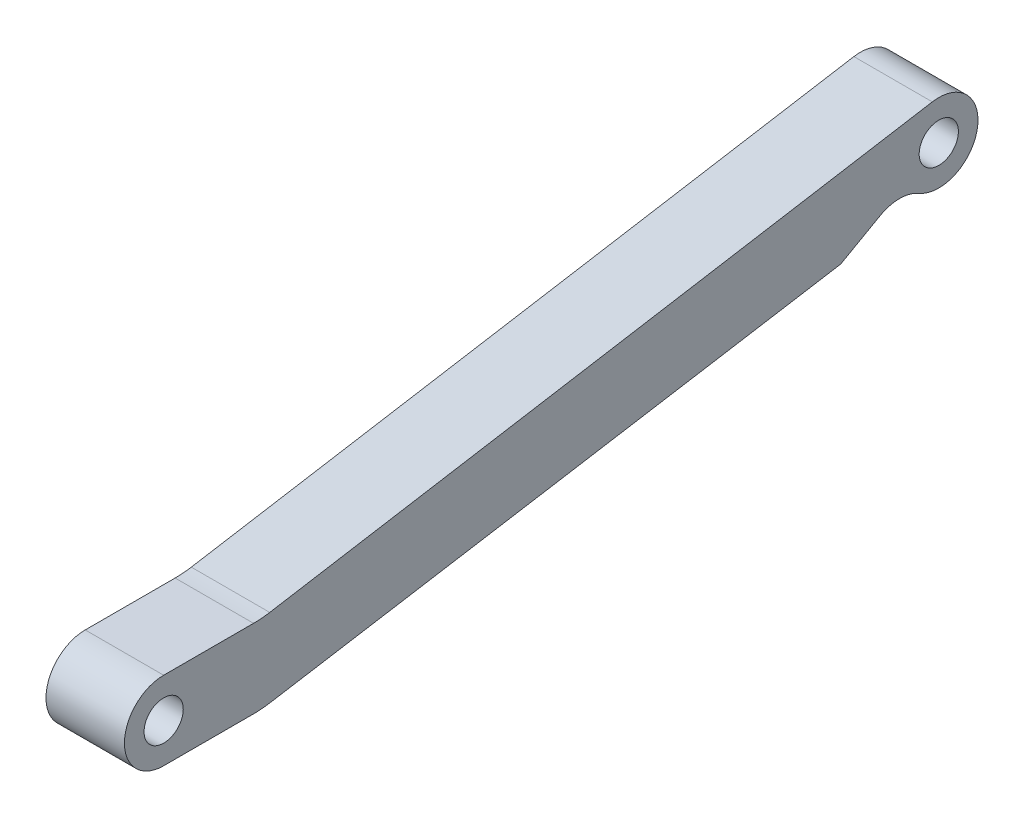
ISO-10303-21;
HEADER;
FILE_DESCRIPTION(('STEP AP214'),'2;1');
FILE_NAME('part.step','',(''),(''),'','','');
FILE_SCHEMA(('AUTOMOTIVE_DESIGN { 1 0 10303 214 1 1 1 1 }'));
ENDSEC;
DATA;
#1=APPLICATION_CONTEXT('core data for automotive mechanical design processes');
#2=APPLICATION_PROTOCOL_DEFINITION('international standard','automotive_design',2000,#1);
#3=PRODUCT_CONTEXT('',#1,'mechanical');
#4=PRODUCT('Part','Part','',(#3));
#5=PRODUCT_RELATED_PRODUCT_CATEGORY('part','',(#4));
#6=PRODUCT_DEFINITION_FORMATION('','',#4);
#7=PRODUCT_DEFINITION_CONTEXT('part definition',#1,'design');
#8=PRODUCT_DEFINITION('design','',#6,#7);
#9=PRODUCT_DEFINITION_SHAPE('','',#8);
#10=(LENGTH_UNIT() NAMED_UNIT(*) SI_UNIT(.MILLI.,.METRE.));
#11=(NAMED_UNIT(*) PLANE_ANGLE_UNIT() SI_UNIT($,.RADIAN.));
#12=(NAMED_UNIT(*) SI_UNIT($,.STERADIAN.) SOLID_ANGLE_UNIT());
#13=UNCERTAINTY_MEASURE_WITH_UNIT(LENGTH_MEASURE(1.E-05),#10,'distance_accuracy_value','');
#14=(GEOMETRIC_REPRESENTATION_CONTEXT(3) GLOBAL_UNCERTAINTY_ASSIGNED_CONTEXT((#13)) GLOBAL_UNIT_ASSIGNED_CONTEXT((#10,
#11,#12)) REPRESENTATION_CONTEXT('',''));
#15=CARTESIAN_POINT('',(0.,0.,0.));
#16=DIRECTION('',(0.,0.,1.));
#17=DIRECTION('',(1.,0.,0.));
#18=AXIS2_PLACEMENT_3D('',#15,#16,#17);
#19=CARTESIAN_POINT('',(-2.,-1.71239706498406,-37.524508406473));
#20=DIRECTION('',(1.,0.,0.));
#21=DIRECTION('',(0.,0.,-1.));
#22=AXIS2_PLACEMENT_3D('',#19,#20,#21);
#23=CYLINDRICAL_SURFACE('',#22,2.);
#24=DIRECTION('',(1.,0.,0.));
#25=VECTOR('',#24,1.);
#26=CARTESIAN_POINT('',(-2.,0.0188014675079667,-38.5259831396028));
#27=LINE('',#26,#25);
#28=CARTESIAN_POINT('',(-2.,0.0188014675079667,-38.5259831396028));
#29=VERTEX_POINT('',#28);
#30=CARTESIAN_POINT('',(2.,0.0188014675079667,-38.5259831396028));
#31=VERTEX_POINT('',#30);
#32=EDGE_CURVE('E43',#29,#31,#27,.T.);
#33=ORIENTED_EDGE('',*,*,#32,.T.);
#34=CARTESIAN_POINT('',(2.,-1.71239706498406,-37.524508406473));
#35=DIRECTION('',(1.,0.,0.));
#36=DIRECTION('',(0.,0.,-1.));
#37=AXIS2_PLACEMENT_3D('',#34,#35,#36);
#38=CIRCLE('',#37,2.);
#39=CARTESIAN_POINT('',(2.,0.0298442239393699,-36.5423702842262));
#40=VERTEX_POINT('',#39);
#41=EDGE_CURVE('E120',#31,#40,#38,.T.);
#42=ORIENTED_EDGE('',*,*,#41,.T.);
#43=DIRECTION('',(1.,0.,0.));
#44=VECTOR('',#43,1.);
#45=CARTESIAN_POINT('',(-2.,0.0298442239393699,-36.5423702842262));
#46=LINE('',#45,#44);
#47=CARTESIAN_POINT('',(-2.,0.0298442239393699,-36.5423702842262));
#48=VERTEX_POINT('',#47);
#49=EDGE_CURVE('E11',#48,#40,#46,.T.);
#50=ORIENTED_EDGE('',*,*,#49,.F.);
#51=CARTESIAN_POINT('',(-2.,-1.71239706498406,-37.524508406473));
#52=DIRECTION('',(1.,0.,0.));
#53=DIRECTION('',(0.,0.,-1.));
#54=AXIS2_PLACEMENT_3D('',#51,#52,#53);
#55=CIRCLE('',#54,2.);
#56=EDGE_CURVE('E56',#29,#48,#55,.T.);
#57=ORIENTED_EDGE('',*,*,#56,.F.);
#58=EDGE_LOOP('',(#33,#42,#50,#57));
#59=FACE_BOUND('',#58,.T.);
#60=ADVANCED_FACE('F39',(#59),#23,.F.);
#61=CARTESIAN_POINT('',(-2.,-15.609462343075,-8.79938280212735));
#62=DIRECTION('',(0.,-0.871120644461721,-0.491069061123379));
#63=DIRECTION('',(0.,0.491069061123379,-0.871120644461721));
#64=AXIS2_PLACEMENT_3D('',#61,#62,#63);
#65=PLANE('',#64);
#66=ORIENTED_EDGE('',*,*,#49,.T.);
#67=DIRECTION('',(0.,0.491069061123379,-0.871120644461721));
#68=VECTOR('',#67,1.);
#69=CARTESIAN_POINT('',(2.,-15.609462343075,-8.79938280212735));
#70=LINE('',#69,#68);
#71=CARTESIAN_POINT('',(2.,-1.1060043550705,-34.5274578727326));
#72=VERTEX_POINT('',#71);
#73=EDGE_CURVE('E137',#72,#40,#70,.T.);
#74=ORIENTED_EDGE('',*,*,#73,.F.);
#75=DIRECTION('',(1.,0.,0.));
#76=VECTOR('',#75,1.);
#77=CARTESIAN_POINT('',(-2.,-1.1060043550705,-34.5274578727326));
#78=LINE('',#77,#76);
#79=CARTESIAN_POINT('',(-2.,-1.1060043550705,-34.5274578727326));
#80=VERTEX_POINT('',#79);
#81=EDGE_CURVE('E48',#80,#72,#78,.T.);
#82=ORIENTED_EDGE('',*,*,#81,.F.);
#83=DIRECTION('',(0.,0.491069061123379,-0.871120644461721));
#84=VECTOR('',#83,1.);
#85=CARTESIAN_POINT('',(-2.,-15.609462343075,-8.79938280212735));
#86=LINE('',#85,#84);
#87=EDGE_CURVE('E124',#80,#48,#86,.T.);
#88=ORIENTED_EDGE('',*,*,#87,.T.);
#89=EDGE_LOOP('',(#66,#74,#82,#88));
#90=FACE_BOUND('',#89,.T.);
#91=ADVANCED_FACE('F232',(#90),#65,.T.);
#92=CARTESIAN_POINT('',(-2.,-6.64614300120225,-1.10155757544909));
#93=DIRECTION('',(0.,-0.986541152083163,-0.163513165361157));
#94=DIRECTION('',(0.,0.163513165361157,-0.986541152083163));
#95=AXIS2_PLACEMENT_3D('',#92,#93,#94);
#96=PLANE('',#95);
#97=ORIENTED_EDGE('',*,*,#81,.T.);
#98=DIRECTION('',(0.,0.163513165361157,-0.986541152083163));
#99=VECTOR('',#98,1.);
#100=CARTESIAN_POINT('',(2.,-6.64614300120225,-1.10155757544909));
#101=LINE('',#100,#99);
#102=CARTESIAN_POINT('',(2.,-5.93270576041582,-5.40601340265965));
#103=VERTEX_POINT('',#102);
#104=EDGE_CURVE('E161',#103,#72,#101,.T.);
#105=ORIENTED_EDGE('',*,*,#104,.F.);
#106=DIRECTION('',(1.,0.,0.));
#107=VECTOR('',#106,1.);
#108=CARTESIAN_POINT('',(-2.,-5.93270576041582,-5.40601340265965));
#109=LINE('',#108,#107);
#110=CARTESIAN_POINT('',(-2.,-5.93270576041582,-5.40601340265965));
#111=VERTEX_POINT('',#110);
#112=EDGE_CURVE('E192',#111,#103,#109,.T.);
#113=ORIENTED_EDGE('',*,*,#112,.F.);
#114=DIRECTION('',(0.,0.163513165361157,-0.986541152083163));
#115=VECTOR('',#114,1.);
#116=CARTESIAN_POINT('',(-2.,-6.64614300120225,-1.10155757544909));
#117=LINE('',#116,#115);
#118=EDGE_CURVE('E188',#111,#80,#117,.T.);
#119=ORIENTED_EDGE('',*,*,#118,.T.);
#120=EDGE_LOOP('',(#97,#105,#113,#119));
#121=FACE_BOUND('',#120,.T.);
#122=ADVANCED_FACE('F230',(#121),#96,.T.);
#123=CARTESIAN_POINT('',(-2.,-1.,-4.58844757585387));
#124=DIRECTION('',(1.,0.,0.));
#125=DIRECTION('',(0.,0.,-1.));
#126=AXIS2_PLACEMENT_3D('',#123,#124,#125);
#127=CYLINDRICAL_SURFACE('',#126,5.);
#128=ORIENTED_EDGE('',*,*,#112,.T.);
#129=CARTESIAN_POINT('',(2.,-1.,-4.58844757585387));
#130=DIRECTION('',(1.,0.,0.));
#131=DIRECTION('',(0.,0.,-1.));
#132=AXIS2_PLACEMENT_3D('',#129,#130,#131);
#133=CIRCLE('',#132,5.);
#134=CARTESIAN_POINT('',(2.,-6.,-4.58844757585387));
#135=VERTEX_POINT('',#134);
#136=EDGE_CURVE('E158',#135,#103,#133,.T.);
#137=ORIENTED_EDGE('',*,*,#136,.F.);
#138=DIRECTION('',(1.,0.,0.));
#139=VECTOR('',#138,1.);
#140=CARTESIAN_POINT('',(-2.,-6.,-4.58844757585387));
#141=LINE('',#140,#139);
#142=CARTESIAN_POINT('',(-2.,-6.,-4.58844757585387));
#143=VERTEX_POINT('',#142);
#144=EDGE_CURVE('E194',#143,#135,#141,.T.);
#145=ORIENTED_EDGE('',*,*,#144,.F.);
#146=CARTESIAN_POINT('',(-2.,-1.,-4.58844757585387));
#147=DIRECTION('',(1.,0.,0.));
#148=DIRECTION('',(0.,0.,-1.));
#149=AXIS2_PLACEMENT_3D('',#146,#147,#148);
#150=CIRCLE('',#149,5.);
#151=EDGE_CURVE('E185',#143,#111,#150,.T.);
#152=ORIENTED_EDGE('',*,*,#151,.T.);
#153=EDGE_LOOP('',(#128,#137,#145,#152));
#154=FACE_BOUND('',#153,.T.);
#155=ADVANCED_FACE('F227',(#154),#127,.T.);
#156=CARTESIAN_POINT('',(-2.,-6.,0.));
#157=DIRECTION('',(0.,-1.,0.));
#158=DIRECTION('',(0.,0.,-1.));
#159=AXIS2_PLACEMENT_3D('',#156,#157,#158);
#160=PLANE('',#159);
#161=ORIENTED_EDGE('',*,*,#144,.T.);
#162=DIRECTION('',(0.,0.,-1.));
#163=VECTOR('',#162,1.);
#164=CARTESIAN_POINT('',(2.,-6.,0.));
#165=LINE('',#164,#163);
#166=CARTESIAN_POINT('',(2.,-6.,0.));
#167=VERTEX_POINT('',#166);
#168=EDGE_CURVE('E155',#167,#135,#165,.T.);
#169=ORIENTED_EDGE('',*,*,#168,.F.);
#170=DIRECTION('',(1.,0.,0.));
#171=VECTOR('',#170,1.);
#172=CARTESIAN_POINT('',(-2.,-6.,0.));
#173=LINE('',#172,#171);
#174=CARTESIAN_POINT('',(-2.,-6.,0.));
#175=VERTEX_POINT('',#174);
#176=EDGE_CURVE('E196',#175,#167,#173,.T.);
#177=ORIENTED_EDGE('',*,*,#176,.F.);
#178=DIRECTION('',(0.,0.,-1.));
#179=VECTOR('',#178,1.);
#180=CARTESIAN_POINT('',(-2.,-6.,0.));
#181=LINE('',#180,#179);
#182=EDGE_CURVE('E182',#175,#143,#181,.T.);
#183=ORIENTED_EDGE('',*,*,#182,.T.);
#184=EDGE_LOOP('',(#161,#169,#177,#183));
#185=FACE_BOUND('',#184,.T.);
#186=ADVANCED_FACE('F223',(#185),#160,.T.);
#187=CARTESIAN_POINT('',(-2.,-4.,0.));
#188=DIRECTION('',(1.,0.,0.));
#189=DIRECTION('',(0.,0.,-1.));
#190=AXIS2_PLACEMENT_3D('',#187,#188,#189);
#191=CYLINDRICAL_SURFACE('',#190,2.);
#192=ORIENTED_EDGE('',*,*,#176,.T.);
#193=CARTESIAN_POINT('',(2.,-4.,0.));
#194=DIRECTION('',(1.,0.,0.));
#195=DIRECTION('',(0.,0.,-1.));
#196=AXIS2_PLACEMENT_3D('',#193,#194,#195);
#197=CIRCLE('',#196,2.);
#198=CARTESIAN_POINT('',(2.,-2.,0.));
#199=VERTEX_POINT('',#198);
#200=EDGE_CURVE('E152',#199,#167,#197,.T.);
#201=ORIENTED_EDGE('',*,*,#200,.F.);
#202=DIRECTION('',(1.,0.,0.));
#203=VECTOR('',#202,1.);
#204=CARTESIAN_POINT('',(-2.,-2.,0.));
#205=LINE('',#204,#203);
#206=CARTESIAN_POINT('',(-2.,-2.,0.));
#207=VERTEX_POINT('',#206);
#208=EDGE_CURVE('E198',#207,#199,#205,.T.);
#209=ORIENTED_EDGE('',*,*,#208,.F.);
#210=CARTESIAN_POINT('',(-2.,-4.,0.));
#211=DIRECTION('',(1.,0.,0.));
#212=DIRECTION('',(0.,0.,-1.));
#213=AXIS2_PLACEMENT_3D('',#210,#211,#212);
#214=CIRCLE('',#213,2.);
#215=EDGE_CURVE('E179',#207,#175,#214,.T.);
#216=ORIENTED_EDGE('',*,*,#215,.T.);
#217=EDGE_LOOP('',(#192,#201,#209,#216));
#218=FACE_BOUND('',#217,.T.);
#219=ADVANCED_FACE('F220',(#218),#191,.T.);
#220=CARTESIAN_POINT('',(-2.,-2.,0.));
#221=DIRECTION('',(0.,-1.,0.));
#222=DIRECTION('',(0.,0.,-1.));
#223=AXIS2_PLACEMENT_3D('',#220,#221,#222);
#224=PLANE('',#223);
#225=ORIENTED_EDGE('',*,*,#208,.T.);
#226=DIRECTION('',(0.,0.,-1.));
#227=VECTOR('',#226,1.);
#228=CARTESIAN_POINT('',(2.,-2.,0.));
#229=LINE('',#228,#227);
#230=CARTESIAN_POINT('',(2.,-2.,-4.58453953493418));
#231=VERTEX_POINT('',#230);
#232=EDGE_CURVE('E149',#199,#231,#229,.T.);
#233=ORIENTED_EDGE('',*,*,#232,.T.);
#234=DIRECTION('',(1.,0.,0.));
#235=VECTOR('',#234,1.);
#236=CARTESIAN_POINT('',(-2.,-2.,-4.58453953493418));
#237=LINE('',#236,#235);
#238=CARTESIAN_POINT('',(-2.,-2.,-4.58453953493418));
#239=VERTEX_POINT('',#238);
#240=EDGE_CURVE('E200',#239,#231,#237,.T.);
#241=ORIENTED_EDGE('',*,*,#240,.F.);
#242=DIRECTION('',(0.,0.,-1.));
#243=VECTOR('',#242,1.);
#244=CARTESIAN_POINT('',(-2.,-2.,0.));
#245=LINE('',#244,#243);
#246=EDGE_CURVE('E177',#207,#239,#245,.T.);
#247=ORIENTED_EDGE('',*,*,#246,.F.);
#248=EDGE_LOOP('',(#225,#233,#241,#247));
#249=FACE_BOUND('',#248,.T.);
#250=ADVANCED_FACE('F215',(#249),#224,.F.);
#251=CARTESIAN_POINT('',(-2.,3.,-4.58453953493418));
#252=DIRECTION('',(1.,0.,0.));
#253=DIRECTION('',(0.,0.,-1.));
#254=AXIS2_PLACEMENT_3D('',#251,#252,#253);
#255=CYLINDRICAL_SURFACE('',#254,5.);
#256=ORIENTED_EDGE('',*,*,#240,.T.);
#257=CARTESIAN_POINT('',(2.,3.,-4.58453953493418));
#258=DIRECTION('',(1.,0.,0.));
#259=DIRECTION('',(0.,0.,-1.));
#260=AXIS2_PLACEMENT_3D('',#257,#258,#259);
#261=CIRCLE('',#260,5.);
#262=CARTESIAN_POINT('',(2.,-1.93143046514675,-5.40976287889783));
#263=VERTEX_POINT('',#262);
#264=EDGE_CURVE('E146',#231,#263,#261,.T.);
#265=ORIENTED_EDGE('',*,*,#264,.T.);
#266=DIRECTION('',(1.,0.,0.));
#267=VECTOR('',#266,1.);
#268=CARTESIAN_POINT('',(-2.,-1.93143046514675,-5.40976287889783));
#269=LINE('',#268,#267);
#270=CARTESIAN_POINT('',(-2.,-1.93143046514675,-5.40976287889783));
#271=VERTEX_POINT('',#270);
#272=EDGE_CURVE('E202',#271,#263,#269,.T.);
#273=ORIENTED_EDGE('',*,*,#272,.F.);
#274=CARTESIAN_POINT('',(-2.,3.,-4.58453953493418));
#275=DIRECTION('',(1.,0.,0.));
#276=DIRECTION('',(0.,0.,-1.));
#277=AXIS2_PLACEMENT_3D('',#274,#275,#276);
#278=CIRCLE('',#277,5.);
#279=EDGE_CURVE('E175',#239,#271,#278,.T.);
#280=ORIENTED_EDGE('',*,*,#279,.F.);
#281=EDGE_LOOP('',(#256,#265,#273,#280));
#282=FACE_BOUND('',#281,.T.);
#283=ADVANCED_FACE('F211',(#282),#255,.F.);
#284=CARTESIAN_POINT('',(-2.,-2.75942682240071,-0.461761236602314));
#285=DIRECTION('',(0.,-0.986286093029349,-0.165044668792729));
#286=DIRECTION('',(0.,0.165044668792729,-0.986286093029349));
#287=AXIS2_PLACEMENT_3D('',#284,#285,#286);
#288=PLANE('',#287);
#289=ORIENTED_EDGE('',*,*,#272,.T.);
#290=DIRECTION('',(0.,0.165044668792729,-0.986286093029349));
#291=VECTOR('',#290,1.);
#292=CARTESIAN_POINT('',(2.,-2.75942682240071,-0.461761236602314));
#293=LINE('',#292,#291);
#294=CARTESIAN_POINT('',(2.,3.7225721860587,-39.1973685351472));
#295=VERTEX_POINT('',#294);
#296=EDGE_CURVE('E132',#263,#295,#293,.T.);
#297=ORIENTED_EDGE('',*,*,#296,.T.);
#298=DIRECTION('',(1.,0.,0.));
#299=VECTOR('',#298,1.);
#300=CARTESIAN_POINT('',(-2.,3.7225721860587,-39.1973685351472));
#301=LINE('',#300,#299);
#302=CARTESIAN_POINT('',(-2.,3.7225721860587,-39.1973685351472));
#303=VERTEX_POINT('',#302);
#304=EDGE_CURVE('E123',#303,#295,#301,.T.);
#305=ORIENTED_EDGE('',*,*,#304,.F.);
#306=DIRECTION('',(0.,0.165044668792729,-0.986286093029349));
#307=VECTOR('',#306,1.);
#308=CARTESIAN_POINT('',(-2.,-2.75942682240071,-0.461761236602314));
#309=LINE('',#308,#307);
#310=EDGE_CURVE('E173',#271,#303,#309,.T.);
#311=ORIENTED_EDGE('',*,*,#310,.F.);
#312=EDGE_LOOP('',(#289,#297,#305,#311));
#313=FACE_BOUND('',#312,.T.);
#314=ADVANCED_FACE('F206',(#313),#288,.F.);
#315=CARTESIAN_POINT('',(-2.,1.75,-39.5274578727326));
#316=DIRECTION('',(1.,0.,0.));
#317=DIRECTION('',(0.,0.,-1.));
#318=AXIS2_PLACEMENT_3D('',#315,#316,#317);
#319=CYLINDRICAL_SURFACE('',#318,0.999999999999998);
#320=CARTESIAN_POINT('',(-2.,1.75,-39.5274578727326));
#321=DIRECTION('',(1.,0.,0.));
#322=DIRECTION('',(0.,0.,-1.));
#323=AXIS2_PLACEMENT_3D('',#320,#321,#322);
#324=CIRCLE('',#323,0.999999999999998);
#325=CARTESIAN_POINT('',(-2.,1.75,-40.5274578727326));
#326=VERTEX_POINT('',#325);
#327=EDGE_CURVE('E167',#326,#326,#324,.T.);
#328=ORIENTED_EDGE('',*,*,#327,.F.);
#329=EDGE_LOOP('',(#328));
#330=FACE_BOUND('',#329,.T.);
#331=CARTESIAN_POINT('',(2.,1.75,-39.5274578727326));
#332=DIRECTION('',(1.,0.,0.));
#333=DIRECTION('',(0.,0.,-1.));
#334=AXIS2_PLACEMENT_3D('',#331,#332,#333);
#335=CIRCLE('',#334,0.999999999999998);
#336=CARTESIAN_POINT('',(2.,1.75,-40.5274578727326));
#337=VERTEX_POINT('',#336);
#338=EDGE_CURVE('E138',#337,#337,#335,.T.);
#339=ORIENTED_EDGE('',*,*,#338,.T.);
#340=EDGE_LOOP('',(#339));
#341=FACE_BOUND('',#340,.T.);
#342=ADVANCED_FACE('F252',(#330,#341),#319,.F.);
#343=CARTESIAN_POINT('',(-2.,-4.,0.));
#344=DIRECTION('',(1.,0.,0.));
#345=DIRECTION('',(0.,0.,-1.));
#346=AXIS2_PLACEMENT_3D('',#343,#344,#345);
#347=CYLINDRICAL_SURFACE('',#346,1.);
#348=CARTESIAN_POINT('',(-2.,-4.,0.));
#349=DIRECTION('',(1.,0.,0.));
#350=DIRECTION('',(0.,0.,-1.));
#351=AXIS2_PLACEMENT_3D('',#348,#349,#350);
#352=CIRCLE('',#351,1.);
#353=CARTESIAN_POINT('',(-2.,-4.,-0.999999999999951));
#354=VERTEX_POINT('',#353);
#355=EDGE_CURVE('E164',#354,#354,#352,.T.);
#356=ORIENTED_EDGE('',*,*,#355,.F.);
#357=EDGE_LOOP('',(#356));
#358=FACE_BOUND('',#357,.T.);
#359=CARTESIAN_POINT('',(2.,-4.,0.));
#360=DIRECTION('',(1.,0.,0.));
#361=DIRECTION('',(0.,0.,-1.));
#362=AXIS2_PLACEMENT_3D('',#359,#360,#361);
#363=CIRCLE('',#362,1.);
#364=CARTESIAN_POINT('',(2.,-4.,-0.999999999999951));
#365=VERTEX_POINT('',#364);
#366=EDGE_CURVE('E141',#365,#365,#363,.T.);
#367=ORIENTED_EDGE('',*,*,#366,.T.);
#368=EDGE_LOOP('',(#367));
#369=FACE_BOUND('',#368,.T.);
#370=ADVANCED_FACE('F41',(#358,#369),#347,.F.);
#371=CARTESIAN_POINT('',(-2.,1.75,-39.5274578727326));
#372=DIRECTION('',(1.,0.,0.));
#373=DIRECTION('',(0.,0.,-1.));
#374=AXIS2_PLACEMENT_3D('',#371,#372,#373);
#375=CYLINDRICAL_SURFACE('',#374,2.);
#376=ORIENTED_EDGE('',*,*,#304,.T.);
#377=CARTESIAN_POINT('',(2.,1.75,-39.5274578727326));
#378=DIRECTION('',(1.,0.,0.));
#379=DIRECTION('',(0.,0.,-1.));
#380=AXIS2_PLACEMENT_3D('',#377,#378,#379);
#381=CIRCLE('',#380,2.);
#382=EDGE_CURVE('E126',#31,#295,#381,.T.);
#383=ORIENTED_EDGE('',*,*,#382,.F.);
#384=ORIENTED_EDGE('',*,*,#32,.F.);
#385=CARTESIAN_POINT('',(-2.,1.75,-39.5274578727326));
#386=DIRECTION('',(1.,0.,0.));
#387=DIRECTION('',(0.,0.,-1.));
#388=AXIS2_PLACEMENT_3D('',#385,#386,#387);
#389=CIRCLE('',#388,2.);
#390=EDGE_CURVE('E171',#29,#303,#389,.T.);
#391=ORIENTED_EDGE('',*,*,#390,.T.);
#392=EDGE_LOOP('',(#376,#383,#384,#391));
#393=FACE_BOUND('',#392,.T.);
#394=ADVANCED_FACE('F127',(#393),#375,.T.);
#395=CARTESIAN_POINT('',(-2.,0.,0.));
#396=DIRECTION('',(1.,0.,0.));
#397=DIRECTION('',(0.,0.,-1.));
#398=AXIS2_PLACEMENT_3D('',#395,#396,#397);
#399=PLANE('',#398);
#400=ORIENTED_EDGE('',*,*,#355,.T.);
#401=EDGE_LOOP('',(#400));
#402=FACE_BOUND('',#401,.T.);
#403=ORIENTED_EDGE('',*,*,#327,.T.);
#404=EDGE_LOOP('',(#403));
#405=FACE_BOUND('',#404,.T.);
#406=ORIENTED_EDGE('',*,*,#56,.T.);
#407=ORIENTED_EDGE('',*,*,#87,.F.);
#408=ORIENTED_EDGE('',*,*,#118,.F.);
#409=ORIENTED_EDGE('',*,*,#151,.F.);
#410=ORIENTED_EDGE('',*,*,#182,.F.);
#411=ORIENTED_EDGE('',*,*,#215,.F.);
#412=ORIENTED_EDGE('',*,*,#246,.T.);
#413=ORIENTED_EDGE('',*,*,#279,.T.);
#414=ORIENTED_EDGE('',*,*,#310,.T.);
#415=ORIENTED_EDGE('',*,*,#390,.F.);
#416=EDGE_LOOP('',(#406,#407,#408,#409,#410,#411,#412,#413,#414,#415));
#417=FACE_BOUND('',#416,.T.);
#418=ADVANCED_FACE('F233',(#402,#405,#417),#399,.F.);
#419=CARTESIAN_POINT('',(2.,0.,0.));
#420=DIRECTION('',(1.,0.,0.));
#421=DIRECTION('',(0.,0.,-1.));
#422=AXIS2_PLACEMENT_3D('',#419,#420,#421);
#423=PLANE('',#422);
#424=ORIENTED_EDGE('',*,*,#366,.F.);
#425=EDGE_LOOP('',(#424));
#426=FACE_BOUND('',#425,.T.);
#427=ORIENTED_EDGE('',*,*,#338,.F.);
#428=EDGE_LOOP('',(#427));
#429=FACE_BOUND('',#428,.T.);
#430=ORIENTED_EDGE('',*,*,#41,.F.);
#431=ORIENTED_EDGE('',*,*,#382,.T.);
#432=ORIENTED_EDGE('',*,*,#296,.F.);
#433=ORIENTED_EDGE('',*,*,#264,.F.);
#434=ORIENTED_EDGE('',*,*,#232,.F.);
#435=ORIENTED_EDGE('',*,*,#200,.T.);
#436=ORIENTED_EDGE('',*,*,#168,.T.);
#437=ORIENTED_EDGE('',*,*,#136,.T.);
#438=ORIENTED_EDGE('',*,*,#104,.T.);
#439=ORIENTED_EDGE('',*,*,#73,.T.);
#440=EDGE_LOOP('',(#430,#431,#432,#433,#434,#435,#436,#437,#438,#439));
#441=FACE_BOUND('',#440,.T.);
#442=ADVANCED_FACE('F135',(#426,#429,#441),#423,.T.);
#443=CLOSED_SHELL('',(#60,#91,#122,#155,#186,#219,#250,#283,#314,#342,#370,#394,#418,#442));
#444=MANIFOLD_SOLID_BREP('B2',#443);
#445=ADVANCED_BREP_SHAPE_REPRESENTATION('',(#18,#444),#14);
#446=SHAPE_DEFINITION_REPRESENTATION(#9,#445);
ENDSEC;
END-ISO-10303-21;
